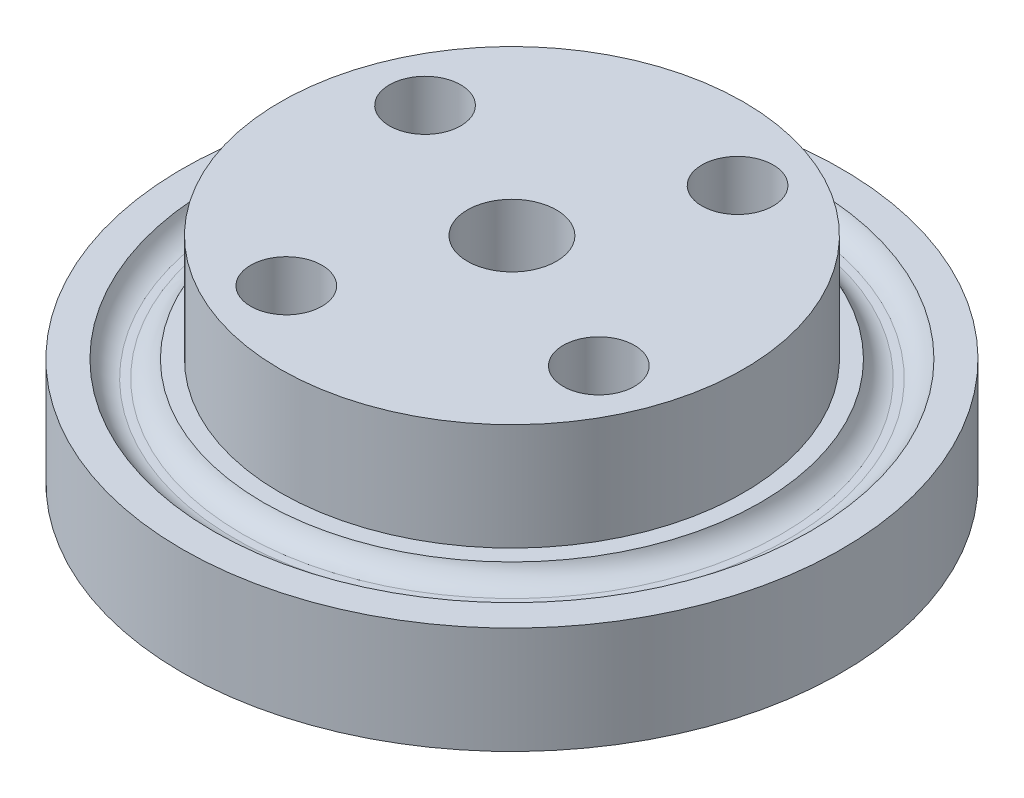
ISO-10303-21;
HEADER;
FILE_DESCRIPTION(('STEP AP214'),'2;1');
FILE_NAME('part.step','',(''),(''),'','','');
FILE_SCHEMA(('AUTOMOTIVE_DESIGN { 1 0 10303 214 1 1 1 1 }'));
ENDSEC;
DATA;
#1=APPLICATION_CONTEXT('core data for automotive mechanical design processes');
#2=APPLICATION_PROTOCOL_DEFINITION('international standard','automotive_design',2000,#1);
#3=PRODUCT_CONTEXT('',#1,'mechanical');
#4=PRODUCT('Part','Part','',(#3));
#5=PRODUCT_RELATED_PRODUCT_CATEGORY('part','',(#4));
#6=PRODUCT_DEFINITION_FORMATION('','',#4);
#7=PRODUCT_DEFINITION_CONTEXT('part definition',#1,'design');
#8=PRODUCT_DEFINITION('design','',#6,#7);
#9=PRODUCT_DEFINITION_SHAPE('','',#8);
#10=(LENGTH_UNIT() NAMED_UNIT(*) SI_UNIT(.MILLI.,.METRE.));
#11=(NAMED_UNIT(*) PLANE_ANGLE_UNIT() SI_UNIT($,.RADIAN.));
#12=(NAMED_UNIT(*) SI_UNIT($,.STERADIAN.) SOLID_ANGLE_UNIT());
#13=UNCERTAINTY_MEASURE_WITH_UNIT(LENGTH_MEASURE(1.E-05),#10,'distance_accuracy_value','');
#14=(GEOMETRIC_REPRESENTATION_CONTEXT(3) GLOBAL_UNCERTAINTY_ASSIGNED_CONTEXT((#13)) GLOBAL_UNIT_ASSIGNED_CONTEXT((#10,
#11,#12)) REPRESENTATION_CONTEXT('',''));
#15=CARTESIAN_POINT('',(0.,0.,0.));
#16=DIRECTION('',(0.,0.,1.));
#17=DIRECTION('',(1.,0.,0.));
#18=AXIS2_PLACEMENT_3D('',#15,#16,#17);
#19=CARTESIAN_POINT('',(0.,6.,0.));
#20=DIRECTION('',(0.,1.,0.));
#21=DIRECTION('',(0.,0.,1.));
#22=AXIS2_PLACEMENT_3D('',#19,#20,#21);
#23=PLANE('',#22);
#24=CARTESIAN_POINT('',(0.,6.,0.));
#25=DIRECTION('',(0.,-1.,0.));
#26=DIRECTION('',(0.,0.,-1.));
#27=AXIS2_PLACEMENT_3D('',#24,#25,#26);
#28=CIRCLE('',#27,13.9538020285806);
#29=CARTESIAN_POINT('',(0.,6.,-13.9538020285806));
#30=VERTEX_POINT('',#29);
#31=EDGE_CURVE('E59',#30,#30,#28,.T.);
#32=ORIENTED_EDGE('',*,*,#31,.F.);
#33=EDGE_LOOP('',(#32));
#34=FACE_BOUND('',#33,.T.);
#35=CARTESIAN_POINT('',(0.,6.,0.));
#36=DIRECTION('',(0.,1.,0.));
#37=DIRECTION('',(0.,0.,1.));
#38=AXIS2_PLACEMENT_3D('',#35,#36,#37);
#39=CIRCLE('',#38,13.);
#40=CARTESIAN_POINT('',(0.,6.,13.));
#41=VERTEX_POINT('',#40);
#42=EDGE_CURVE('E66',#41,#41,#39,.T.);
#43=ORIENTED_EDGE('',*,*,#42,.F.);
#44=EDGE_LOOP('',(#43));
#45=FACE_BOUND('',#44,.T.);
#46=ADVANCED_FACE('F29',(#34,#45),#23,.T.);
#47=CARTESIAN_POINT('',(0.,6.,0.));
#48=DIRECTION('',(0.,1.,0.));
#49=DIRECTION('',(0.,0.,1.));
#50=AXIS2_PLACEMENT_3D('',#47,#48,#49);
#51=CIRCLE('',#50,18.5);
#52=CARTESIAN_POINT('',(0.,6.,18.5));
#53=VERTEX_POINT('',#52);
#54=EDGE_CURVE('E10',#53,#53,#51,.T.);
#55=ORIENTED_EDGE('',*,*,#54,.T.);
#56=EDGE_LOOP('',(#55));
#57=FACE_BOUND('',#56,.T.);
#58=CARTESIAN_POINT('',(0.,6.,0.));
#59=DIRECTION('',(0.,-1.,0.));
#60=DIRECTION('',(0.,0.,-1.));
#61=AXIS2_PLACEMENT_3D('',#58,#59,#60);
#62=CIRCLE('',#61,16.7514896221567);
#63=CARTESIAN_POINT('',(0.,6.,-16.7514896221567));
#64=VERTEX_POINT('',#63);
#65=EDGE_CURVE('E62',#64,#64,#62,.T.);
#66=ORIENTED_EDGE('',*,*,#65,.T.);
#67=EDGE_LOOP('',(#66));
#68=FACE_BOUND('',#67,.T.);
#69=ADVANCED_FACE('F135',(#57,#68),#23,.T.);
#70=CARTESIAN_POINT('',(0.,0.,0.));
#71=DIRECTION('',(0.,1.,0.));
#72=DIRECTION('',(0.,0.,1.));
#73=AXIS2_PLACEMENT_3D('',#70,#71,#72);
#74=PLANE('',#73);
#75=CARTESIAN_POINT('',(0.,0.,0.));
#76=DIRECTION('',(0.,1.,0.));
#77=DIRECTION('',(0.,0.,1.));
#78=AXIS2_PLACEMENT_3D('',#75,#76,#77);
#79=CIRCLE('',#78,16.2803915448644);
#80=CARTESIAN_POINT('',(0.,0.,16.2803915448644));
#81=VERTEX_POINT('',#80);
#82=EDGE_CURVE('E50',#81,#81,#79,.T.);
#83=ORIENTED_EDGE('',*,*,#82,.T.);
#84=EDGE_LOOP('',(#83));
#85=FACE_BOUND('',#84,.T.);
#86=CARTESIAN_POINT('',(0.,0.,0.));
#87=DIRECTION('',(0.,1.,0.));
#88=DIRECTION('',(0.,0.,1.));
#89=AXIS2_PLACEMENT_3D('',#86,#87,#88);
#90=CIRCLE('',#89,18.5);
#91=CARTESIAN_POINT('',(0.,0.,18.5));
#92=VERTEX_POINT('',#91);
#93=EDGE_CURVE('E33',#92,#92,#90,.T.);
#94=ORIENTED_EDGE('',*,*,#93,.F.);
#95=EDGE_LOOP('',(#94));
#96=FACE_BOUND('',#95,.T.);
#97=ADVANCED_FACE('F141',(#85,#96),#74,.F.);
#98=CARTESIAN_POINT('',(0.,6.,0.));
#99=DIRECTION('',(0.,-1.,0.));
#100=DIRECTION('',(0.,0.,-1.));
#101=AXIS2_PLACEMENT_3D('',#98,#99,#100);
#102=CYLINDRICAL_SURFACE('',#101,18.5);
#103=ORIENTED_EDGE('',*,*,#54,.F.);
#104=EDGE_LOOP('',(#103));
#105=FACE_BOUND('',#104,.T.);
#106=ORIENTED_EDGE('',*,*,#93,.T.);
#107=EDGE_LOOP('',(#106));
#108=FACE_BOUND('',#107,.T.);
#109=ADVANCED_FACE('F31',(#105,#108),#102,.T.);
#110=CARTESIAN_POINT('',(0.,-0.595482951756531,0.));
#111=DIRECTION('',(0.,1.,0.));
#112=DIRECTION('',(0.,0.,1.));
#113=AXIS2_PLACEMENT_3D('',#110,#111,#112);
#114=TOROIDAL_SURFACE('',#113,14.7803915448644,1.61387730197579);
#115=ORIENTED_EDGE('',*,*,#82,.F.);
#116=EDGE_LOOP('',(#115));
#117=FACE_BOUND('',#116,.T.);
#118=CARTESIAN_POINT('',(0.,0.999438017645859,0.));
#119=DIRECTION('',(0.,1.,0.));
#120=DIRECTION('',(0.,0.,1.));
#121=AXIS2_PLACEMENT_3D('',#118,#119,#120);
#122=CIRCLE('',#121,15.0270229443115);
#123=CARTESIAN_POINT('',(0.,0.999438017645859,15.0270229443115));
#124=VERTEX_POINT('',#123);
#125=EDGE_CURVE('E40',#124,#124,#122,.T.);
#126=ORIENTED_EDGE('',*,*,#125,.T.);
#127=EDGE_LOOP('',(#126));
#128=FACE_BOUND('',#127,.T.);
#129=ADVANCED_FACE('F144',(#117,#128),#114,.F.);
#130=CARTESIAN_POINT('',(-15.0270229443115,0.999438017645859,0.));
#131=DIRECTION('',(0.,1.,0.));
#132=DIRECTION('',(0.,0.,1.));
#133=AXIS2_PLACEMENT_3D('',#130,#131,#132);
#134=PLANE('',#133);
#135=ORIENTED_EDGE('',*,*,#125,.F.);
#136=EDGE_LOOP('',(#135));
#137=FACE_BOUND('',#136,.T.);
#138=CARTESIAN_POINT('',(0.,0.999438017645859,0.));
#139=DIRECTION('',(0.,1.,0.));
#140=DIRECTION('',(0.,0.,1.));
#141=AXIS2_PLACEMENT_3D('',#138,#139,#140);
#142=CIRCLE('',#141,14.5337601454174);
#143=CARTESIAN_POINT('',(0.,0.999438017645859,14.5337601454174));
#144=VERTEX_POINT('',#143);
#145=EDGE_CURVE('E44',#144,#144,#142,.T.);
#146=ORIENTED_EDGE('',*,*,#145,.T.);
#147=EDGE_LOOP('',(#146));
#148=FACE_BOUND('',#147,.T.);
#149=ADVANCED_FACE('F156',(#137,#148),#134,.F.);
#150=CARTESIAN_POINT('',(0.,-0.595482951756531,0.));
#151=DIRECTION('',(0.,1.,0.));
#152=DIRECTION('',(0.,0.,1.));
#153=AXIS2_PLACEMENT_3D('',#150,#151,#152);
#154=TOROIDAL_SURFACE('',#153,14.7803915448644,1.61387730197579);
#155=ORIENTED_EDGE('',*,*,#145,.F.);
#156=EDGE_LOOP('',(#155));
#157=FACE_BOUND('',#156,.T.);
#158=CARTESIAN_POINT('',(0.,0.,0.));
#159=DIRECTION('',(0.,1.,0.));
#160=DIRECTION('',(0.,0.,1.));
#161=AXIS2_PLACEMENT_3D('',#158,#159,#160);
#162=CIRCLE('',#161,13.2803915448644);
#163=CARTESIAN_POINT('',(0.,0.,13.2803915448644));
#164=VERTEX_POINT('',#163);
#165=EDGE_CURVE('E47',#164,#164,#162,.T.);
#166=ORIENTED_EDGE('',*,*,#165,.T.);
#167=EDGE_LOOP('',(#166));
#168=FACE_BOUND('',#167,.T.);
#169=ADVANCED_FACE('F148',(#157,#168),#154,.F.);
#170=CARTESIAN_POINT('',(-8.77083888809431,0.,-3.89442436557299));
#171=DIRECTION('',(0.,1.,0.));
#172=DIRECTION('',(0.,0.,1.));
#173=AXIS2_PLACEMENT_3D('',#170,#171,#172);
#174=CIRCLE('',#173,2.);
#175=CARTESIAN_POINT('',(-8.77083888809431,0.,-1.89442436557299));
#176=VERTEX_POINT('',#175);
#177=EDGE_CURVE('E93',#176,#176,#174,.T.);
#178=ORIENTED_EDGE('',*,*,#177,.T.);
#179=EDGE_LOOP('',(#178));
#180=FACE_BOUND('',#179,.T.);
#181=CARTESIAN_POINT('',(3.89442436557308,0.,-8.77083888809413));
#182=DIRECTION('',(0.,1.,0.));
#183=DIRECTION('',(0.,0.,1.));
#184=AXIS2_PLACEMENT_3D('',#181,#182,#183);
#185=CIRCLE('',#184,2.);
#186=CARTESIAN_POINT('',(3.89442436557308,0.,-6.77083888809413));
#187=VERTEX_POINT('',#186);
#188=EDGE_CURVE('E87',#187,#187,#185,.T.);
#189=ORIENTED_EDGE('',*,*,#188,.T.);
#190=EDGE_LOOP('',(#189));
#191=FACE_BOUND('',#190,.T.);
#192=CARTESIAN_POINT('',(8.77083888809423,0.,3.89442436557315));
#193=DIRECTION('',(0.,1.,0.));
#194=DIRECTION('',(0.,0.,1.));
#195=AXIS2_PLACEMENT_3D('',#192,#193,#194);
#196=CIRCLE('',#195,2.);
#197=CARTESIAN_POINT('',(8.77083888809423,0.,5.89442436557315));
#198=VERTEX_POINT('',#197);
#199=EDGE_CURVE('E81',#198,#198,#196,.T.);
#200=ORIENTED_EDGE('',*,*,#199,.T.);
#201=EDGE_LOOP('',(#200));
#202=FACE_BOUND('',#201,.T.);
#203=CARTESIAN_POINT('',(-3.89442436557313,0.,8.77083888809439));
#204=DIRECTION('',(0.,1.,0.));
#205=DIRECTION('',(0.,0.,1.));
#206=AXIS2_PLACEMENT_3D('',#203,#204,#205);
#207=CIRCLE('',#206,2.);
#208=CARTESIAN_POINT('',(-3.89442436557313,0.,10.7708388880944));
#209=VERTEX_POINT('',#208);
#210=EDGE_CURVE('E75',#209,#209,#207,.T.);
#211=ORIENTED_EDGE('',*,*,#210,.T.);
#212=EDGE_LOOP('',(#211));
#213=FACE_BOUND('',#212,.T.);
#214=CARTESIAN_POINT('',(0.,0.,0.));
#215=DIRECTION('',(0.,1.,0.));
#216=DIRECTION('',(0.,0.,1.));
#217=AXIS2_PLACEMENT_3D('',#214,#215,#216);
#218=CIRCLE('',#217,2.5);
#219=CARTESIAN_POINT('',(0.,0.,2.5));
#220=VERTEX_POINT('',#219);
#221=EDGE_CURVE('E69',#220,#220,#218,.T.);
#222=ORIENTED_EDGE('',*,*,#221,.T.);
#223=EDGE_LOOP('',(#222));
#224=FACE_BOUND('',#223,.T.);
#225=ORIENTED_EDGE('',*,*,#165,.F.);
#226=EDGE_LOOP('',(#225));
#227=FACE_BOUND('',#226,.T.);
#228=ADVANCED_FACE('F102',(#180,#191,#202,#213,#224,#227),#74,.F.);
#229=CARTESIAN_POINT('',(0.,6.54151272578538,0.));
#230=DIRECTION('',(0.,-1.,0.));
#231=DIRECTION('',(0.,0.,-1.));
#232=AXIS2_PLACEMENT_3D('',#229,#230,#231);
#233=TOROIDAL_SURFACE('',#232,15.3526458253686,1.5);
#234=CARTESIAN_POINT('',(0.,5.05772432979411,0.));
#235=DIRECTION('',(0.,-1.,0.));
#236=DIRECTION('',(0.,0.,-1.));
#237=AXIS2_PLACEMENT_3D('',#234,#235,#236);
#238=CIRCLE('',#237,15.5725821705271);
#239=CARTESIAN_POINT('',(0.,5.05772432979411,-15.5725821705271));
#240=VERTEX_POINT('',#239);
#241=EDGE_CURVE('E53',#240,#240,#238,.T.);
#242=ORIENTED_EDGE('',*,*,#241,.T.);
#243=EDGE_LOOP('',(#242));
#244=FACE_BOUND('',#243,.T.);
#245=ORIENTED_EDGE('',*,*,#65,.F.);
#246=EDGE_LOOP('',(#245));
#247=FACE_BOUND('',#246,.T.);
#248=ADVANCED_FACE('F147',(#244,#247),#233,.F.);
#249=CARTESIAN_POINT('',(-15.5725821705271,5.05772432979411,0.));
#250=DIRECTION('',(0.,1.,0.));
#251=DIRECTION('',(0.,0.,1.));
#252=AXIS2_PLACEMENT_3D('',#249,#250,#251);
#253=PLANE('',#252);
#254=CARTESIAN_POINT('',(0.,5.05772432979411,0.));
#255=DIRECTION('',(0.,-1.,0.));
#256=DIRECTION('',(0.,0.,-1.));
#257=AXIS2_PLACEMENT_3D('',#254,#255,#256);
#258=CIRCLE('',#257,15.1327094802102);
#259=CARTESIAN_POINT('',(0.,5.05772432979411,-15.1327094802102));
#260=VERTEX_POINT('',#259);
#261=EDGE_CURVE('E56',#260,#260,#258,.T.);
#262=ORIENTED_EDGE('',*,*,#261,.T.);
#263=EDGE_LOOP('',(#262));
#264=FACE_BOUND('',#263,.T.);
#265=ORIENTED_EDGE('',*,*,#241,.F.);
#266=EDGE_LOOP('',(#265));
#267=FACE_BOUND('',#266,.T.);
#268=ADVANCED_FACE('F153',(#264,#267),#253,.T.);
#269=CARTESIAN_POINT('',(0.,6.54151272578538,0.));
#270=DIRECTION('',(0.,-1.,0.));
#271=DIRECTION('',(0.,0.,-1.));
#272=AXIS2_PLACEMENT_3D('',#269,#270,#271);
#273=TOROIDAL_SURFACE('',#272,15.3526458253686,1.5);
#274=ORIENTED_EDGE('',*,*,#31,.T.);
#275=EDGE_LOOP('',(#274));
#276=FACE_BOUND('',#275,.T.);
#277=ORIENTED_EDGE('',*,*,#261,.F.);
#278=EDGE_LOOP('',(#277));
#279=FACE_BOUND('',#278,.T.);
#280=ADVANCED_FACE('F130',(#276,#279),#273,.F.);
#281=CARTESIAN_POINT('',(0.,12.,0.));
#282=DIRECTION('',(0.,-1.,0.));
#283=DIRECTION('',(0.,0.,-1.));
#284=AXIS2_PLACEMENT_3D('',#281,#282,#283);
#285=CYLINDRICAL_SURFACE('',#284,13.);
#286=CARTESIAN_POINT('',(0.,12.,0.));
#287=DIRECTION('',(0.,1.,0.));
#288=DIRECTION('',(0.,0.,1.));
#289=AXIS2_PLACEMENT_3D('',#286,#287,#288);
#290=CIRCLE('',#289,13.);
#291=CARTESIAN_POINT('',(0.,12.,13.));
#292=VERTEX_POINT('',#291);
#293=EDGE_CURVE('E65',#292,#292,#290,.T.);
#294=ORIENTED_EDGE('',*,*,#293,.F.);
#295=EDGE_LOOP('',(#294));
#296=FACE_BOUND('',#295,.T.);
#297=ORIENTED_EDGE('',*,*,#42,.T.);
#298=EDGE_LOOP('',(#297));
#299=FACE_BOUND('',#298,.T.);
#300=ADVANCED_FACE('F116',(#296,#299),#285,.T.);
#301=CARTESIAN_POINT('',(0.,12.,0.));
#302=DIRECTION('',(0.,1.,0.));
#303=DIRECTION('',(0.,0.,1.));
#304=AXIS2_PLACEMENT_3D('',#301,#302,#303);
#305=PLANE('',#304);
#306=CARTESIAN_POINT('',(-8.77083888809431,12.,-3.89442436557299));
#307=DIRECTION('',(0.,1.,0.));
#308=DIRECTION('',(0.,0.,1.));
#309=AXIS2_PLACEMENT_3D('',#306,#307,#308);
#310=CIRCLE('',#309,2.);
#311=CARTESIAN_POINT('',(-8.77083888809431,12.,-1.89442436557299));
#312=VERTEX_POINT('',#311);
#313=EDGE_CURVE('E96',#312,#312,#310,.T.);
#314=ORIENTED_EDGE('',*,*,#313,.F.);
#315=EDGE_LOOP('',(#314));
#316=FACE_BOUND('',#315,.T.);
#317=CARTESIAN_POINT('',(3.89442436557308,12.,-8.77083888809413));
#318=DIRECTION('',(0.,1.,0.));
#319=DIRECTION('',(0.,0.,1.));
#320=AXIS2_PLACEMENT_3D('',#317,#318,#319);
#321=CIRCLE('',#320,2.);
#322=CARTESIAN_POINT('',(3.89442436557308,12.,-6.77083888809413));
#323=VERTEX_POINT('',#322);
#324=EDGE_CURVE('E90',#323,#323,#321,.T.);
#325=ORIENTED_EDGE('',*,*,#324,.F.);
#326=EDGE_LOOP('',(#325));
#327=FACE_BOUND('',#326,.T.);
#328=CARTESIAN_POINT('',(8.77083888809423,12.,3.89442436557315));
#329=DIRECTION('',(0.,1.,0.));
#330=DIRECTION('',(0.,0.,1.));
#331=AXIS2_PLACEMENT_3D('',#328,#329,#330);
#332=CIRCLE('',#331,2.);
#333=CARTESIAN_POINT('',(8.77083888809423,12.,5.89442436557315));
#334=VERTEX_POINT('',#333);
#335=EDGE_CURVE('E84',#334,#334,#332,.T.);
#336=ORIENTED_EDGE('',*,*,#335,.F.);
#337=EDGE_LOOP('',(#336));
#338=FACE_BOUND('',#337,.T.);
#339=CARTESIAN_POINT('',(-3.89442436557313,12.,8.77083888809439));
#340=DIRECTION('',(0.,1.,0.));
#341=DIRECTION('',(0.,0.,1.));
#342=AXIS2_PLACEMENT_3D('',#339,#340,#341);
#343=CIRCLE('',#342,2.);
#344=CARTESIAN_POINT('',(-3.89442436557313,12.,10.7708388880944));
#345=VERTEX_POINT('',#344);
#346=EDGE_CURVE('E78',#345,#345,#343,.T.);
#347=ORIENTED_EDGE('',*,*,#346,.F.);
#348=EDGE_LOOP('',(#347));
#349=FACE_BOUND('',#348,.T.);
#350=CARTESIAN_POINT('',(0.,12.,0.));
#351=DIRECTION('',(0.,1.,0.));
#352=DIRECTION('',(0.,0.,1.));
#353=AXIS2_PLACEMENT_3D('',#350,#351,#352);
#354=CIRCLE('',#353,2.5);
#355=CARTESIAN_POINT('',(0.,12.,2.5));
#356=VERTEX_POINT('',#355);
#357=EDGE_CURVE('E72',#356,#356,#354,.T.);
#358=ORIENTED_EDGE('',*,*,#357,.F.);
#359=EDGE_LOOP('',(#358));
#360=FACE_BOUND('',#359,.T.);
#361=ORIENTED_EDGE('',*,*,#293,.T.);
#362=EDGE_LOOP('',(#361));
#363=FACE_BOUND('',#362,.T.);
#364=ADVANCED_FACE('F112',(#316,#327,#338,#349,#360,#363),#305,.T.);
#365=CARTESIAN_POINT('',(0.,0.,0.));
#366=DIRECTION('',(0.,1.,0.));
#367=DIRECTION('',(0.,0.,1.));
#368=AXIS2_PLACEMENT_3D('',#365,#366,#367);
#369=CYLINDRICAL_SURFACE('',#368,2.5);
#370=ORIENTED_EDGE('',*,*,#221,.F.);
#371=EDGE_LOOP('',(#370));
#372=FACE_BOUND('',#371,.T.);
#373=ORIENTED_EDGE('',*,*,#357,.T.);
#374=EDGE_LOOP('',(#373));
#375=FACE_BOUND('',#374,.T.);
#376=ADVANCED_FACE('F115',(#372,#375),#369,.F.);
#377=CARTESIAN_POINT('',(-3.89442436557313,0.,8.77083888809439));
#378=DIRECTION('',(0.,1.,0.));
#379=DIRECTION('',(0.,0.,1.));
#380=AXIS2_PLACEMENT_3D('',#377,#378,#379);
#381=CYLINDRICAL_SURFACE('',#380,2.);
#382=ORIENTED_EDGE('',*,*,#210,.F.);
#383=EDGE_LOOP('',(#382));
#384=FACE_BOUND('',#383,.T.);
#385=ORIENTED_EDGE('',*,*,#346,.T.);
#386=EDGE_LOOP('',(#385));
#387=FACE_BOUND('',#386,.T.);
#388=ADVANCED_FACE('F191',(#384,#387),#381,.F.);
#389=CARTESIAN_POINT('',(8.77083888809423,0.,3.89442436557315));
#390=DIRECTION('',(0.,1.,0.));
#391=DIRECTION('',(0.,0.,1.));
#392=AXIS2_PLACEMENT_3D('',#389,#390,#391);
#393=CYLINDRICAL_SURFACE('',#392,2.);
#394=ORIENTED_EDGE('',*,*,#199,.F.);
#395=EDGE_LOOP('',(#394));
#396=FACE_BOUND('',#395,.T.);
#397=ORIENTED_EDGE('',*,*,#335,.T.);
#398=EDGE_LOOP('',(#397));
#399=FACE_BOUND('',#398,.T.);
#400=ADVANCED_FACE('F195',(#396,#399),#393,.F.);
#401=CARTESIAN_POINT('',(3.89442436557308,0.,-8.77083888809413));
#402=DIRECTION('',(0.,1.,0.));
#403=DIRECTION('',(0.,0.,1.));
#404=AXIS2_PLACEMENT_3D('',#401,#402,#403);
#405=CYLINDRICAL_SURFACE('',#404,2.);
#406=ORIENTED_EDGE('',*,*,#188,.F.);
#407=EDGE_LOOP('',(#406));
#408=FACE_BOUND('',#407,.T.);
#409=ORIENTED_EDGE('',*,*,#324,.T.);
#410=EDGE_LOOP('',(#409));
#411=FACE_BOUND('',#410,.T.);
#412=ADVANCED_FACE('F108',(#408,#411),#405,.F.);
#413=CARTESIAN_POINT('',(-8.77083888809431,0.,-3.89442436557299));
#414=DIRECTION('',(0.,1.,0.));
#415=DIRECTION('',(0.,0.,1.));
#416=AXIS2_PLACEMENT_3D('',#413,#414,#415);
#417=CYLINDRICAL_SURFACE('',#416,2.);
#418=ORIENTED_EDGE('',*,*,#177,.F.);
#419=EDGE_LOOP('',(#418));
#420=FACE_BOUND('',#419,.T.);
#421=ORIENTED_EDGE('',*,*,#313,.T.);
#422=EDGE_LOOP('',(#421));
#423=FACE_BOUND('',#422,.T.);
#424=ADVANCED_FACE('F105',(#420,#423),#417,.F.);
#425=CLOSED_SHELL('',(#46,#69,#97,#109,#129,#149,#169,#228,#248,#268,#280,#300,#364,#376,#388,
#400,#412,#424));
#426=MANIFOLD_SOLID_BREP('B2',#425);
#427=ADVANCED_BREP_SHAPE_REPRESENTATION('',(#18,#426),#14);
#428=SHAPE_DEFINITION_REPRESENTATION(#9,#427);
ENDSEC;
END-ISO-10303-21;
